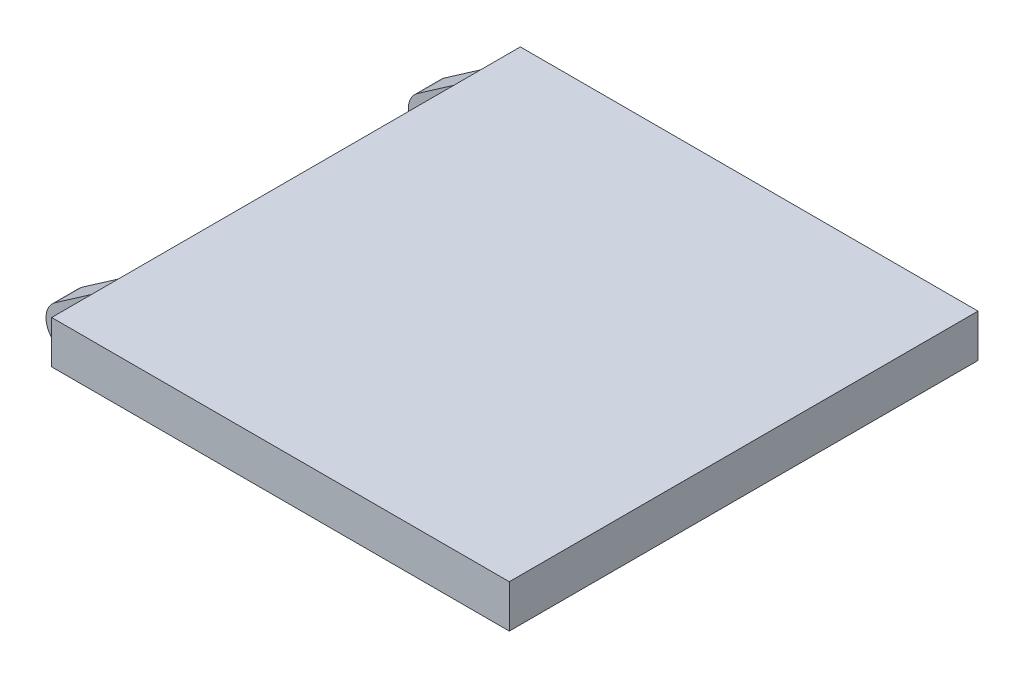
ISO-10303-21;
HEADER;
FILE_DESCRIPTION(('STEP AP214'),'2;1');
FILE_NAME('part.step','',(''),(''),'','','');
FILE_SCHEMA(('AUTOMOTIVE_DESIGN { 1 0 10303 214 1 1 1 1 }'));
ENDSEC;
DATA;
#1=APPLICATION_CONTEXT('core data for automotive mechanical design processes');
#2=APPLICATION_PROTOCOL_DEFINITION('international standard','automotive_design',2000,#1);
#3=PRODUCT_CONTEXT('',#1,'mechanical');
#4=PRODUCT('Part','Part','',(#3));
#5=PRODUCT_RELATED_PRODUCT_CATEGORY('part','',(#4));
#6=PRODUCT_DEFINITION_FORMATION('','',#4);
#7=PRODUCT_DEFINITION_CONTEXT('part definition',#1,'design');
#8=PRODUCT_DEFINITION('design','',#6,#7);
#9=PRODUCT_DEFINITION_SHAPE('','',#8);
#10=(LENGTH_UNIT() NAMED_UNIT(*) SI_UNIT(.MILLI.,.METRE.));
#11=(NAMED_UNIT(*) PLANE_ANGLE_UNIT() SI_UNIT($,.RADIAN.));
#12=(NAMED_UNIT(*) SI_UNIT($,.STERADIAN.) SOLID_ANGLE_UNIT());
#13=UNCERTAINTY_MEASURE_WITH_UNIT(LENGTH_MEASURE(1.E-05),#10,'distance_accuracy_value','');
#14=(GEOMETRIC_REPRESENTATION_CONTEXT(3) GLOBAL_UNCERTAINTY_ASSIGNED_CONTEXT((#13)) GLOBAL_UNIT_ASSIGNED_CONTEXT((#10,
#11,#12)) REPRESENTATION_CONTEXT('',''));
#15=CARTESIAN_POINT('',(0.,0.,0.));
#16=DIRECTION('',(0.,0.,1.));
#17=DIRECTION('',(1.,0.,0.));
#18=AXIS2_PLACEMENT_3D('',#15,#16,#17);
#19=CARTESIAN_POINT('',(-47.2791010767312,0.,-31.37));
#20=DIRECTION('',(0.,0.,-1.));
#21=DIRECTION('',(1.,0.,0.));
#22=AXIS2_PLACEMENT_3D('',#19,#20,#21);
#23=CYLINDRICAL_SURFACE('',#22,4.);
#24=CARTESIAN_POINT('',(-47.2791010767312,0.,-36.37));
#25=DIRECTION('',(0.,0.,-1.));
#26=DIRECTION('',(-1.,0.,0.));
#27=AXIS2_PLACEMENT_3D('',#24,#25,#26);
#28=CIRCLE('',#27,4.);
#29=CARTESIAN_POINT('',(-43.2791010767312,0.,-36.37));
#30=VERTEX_POINT('',#29);
#31=CARTESIAN_POINT('',(-49.5623460176183,3.28432527924895,-36.37));
#32=VERTEX_POINT('',#31);
#33=EDGE_CURVE('E126',#30,#32,#28,.T.);
#34=ORIENTED_EDGE('',*,*,#33,.F.);
#35=DIRECTION('',(0.,0.,-1.));
#36=VECTOR('',#35,1.);
#37=CARTESIAN_POINT('',(-43.2791010767312,0.,-31.37));
#38=LINE('',#37,#36);
#39=CARTESIAN_POINT('',(-43.2791010767312,0.,-31.37));
#40=VERTEX_POINT('',#39);
#41=EDGE_CURVE('E125',#40,#30,#38,.T.);
#42=ORIENTED_EDGE('',*,*,#41,.F.);
#43=CARTESIAN_POINT('',(-47.2791010767312,0.,-31.37));
#44=DIRECTION('',(0.,0.,-1.));
#45=DIRECTION('',(-1.,0.,0.));
#46=AXIS2_PLACEMENT_3D('',#43,#44,#45);
#47=CIRCLE('',#46,4.);
#48=CARTESIAN_POINT('',(-49.5623460176183,3.28432527924895,-31.37));
#49=VERTEX_POINT('',#48);
#50=EDGE_CURVE('E119',#40,#49,#47,.T.);
#51=ORIENTED_EDGE('',*,*,#50,.T.);
#52=DIRECTION('',(0.,0.,-1.));
#53=VECTOR('',#52,1.);
#54=CARTESIAN_POINT('',(-49.5623460176183,3.28432527924895,-31.37));
#55=LINE('',#54,#53);
#56=EDGE_CURVE('E12',#49,#32,#55,.T.);
#57=ORIENTED_EDGE('',*,*,#56,.T.);
#58=EDGE_LOOP('',(#34,#42,#51,#57));
#59=FACE_BOUND('',#58,.T.);
#60=ADVANCED_FACE('F60',(#59),#23,.T.);
#61=CARTESIAN_POINT('',(-42.7791010767312,8.,-31.37));
#62=DIRECTION('',(0.570811235221759,-0.82108131981224,0.));
#63=DIRECTION('',(0.82108131981224,0.570811235221759,0.));
#64=AXIS2_PLACEMENT_3D('',#61,#62,#63);
#65=PLANE('',#64);
#66=DIRECTION('',(0.82108131981224,0.570811235221759,0.));
#67=VECTOR('',#66,1.);
#68=CARTESIAN_POINT('',(-42.7791010767312,8.,-36.37));
#69=LINE('',#68,#67);
#70=CARTESIAN_POINT('',(-42.7791010767312,8.,-36.37));
#71=VERTEX_POINT('',#70);
#72=EDGE_CURVE('E128',#32,#71,#69,.T.);
#73=ORIENTED_EDGE('',*,*,#72,.F.);
#74=ORIENTED_EDGE('',*,*,#56,.F.);
#75=DIRECTION('',(0.82108131981224,0.570811235221759,0.));
#76=VECTOR('',#75,1.);
#77=CARTESIAN_POINT('',(-42.7791010767312,8.,-31.37));
#78=LINE('',#77,#76);
#79=CARTESIAN_POINT('',(-42.7791010767312,8.,-31.37));
#80=VERTEX_POINT('',#79);
#81=EDGE_CURVE('E102',#49,#80,#78,.T.);
#82=ORIENTED_EDGE('',*,*,#81,.T.);
#83=DIRECTION('',(0.,0.,-1.));
#84=VECTOR('',#83,1.);
#85=CARTESIAN_POINT('',(-42.7791010767312,8.,-31.37));
#86=LINE('',#85,#84);
#87=EDGE_CURVE('E69',#80,#71,#86,.T.);
#88=ORIENTED_EDGE('',*,*,#87,.T.);
#89=EDGE_LOOP('',(#73,#74,#82,#88));
#90=FACE_BOUND('',#89,.T.);
#91=ADVANCED_FACE('F117',(#90),#65,.F.);
#92=CARTESIAN_POINT('',(-42.7791010767312,0.,-31.37));
#93=DIRECTION('',(-1.,0.,0.));
#94=DIRECTION('',(0.,0.,-1.));
#95=AXIS2_PLACEMENT_3D('',#92,#93,#94);
#96=PLANE('',#95);
#97=DIRECTION('',(0.,-1.,0.));
#98=VECTOR('',#97,1.);
#99=CARTESIAN_POINT('',(-42.7791010767312,0.,-36.37));
#100=LINE('',#99,#98);
#101=CARTESIAN_POINT('',(-42.7791010767312,0.,-36.37));
#102=VERTEX_POINT('',#101);
#103=EDGE_CURVE('E112',#71,#102,#100,.T.);
#104=ORIENTED_EDGE('',*,*,#103,.F.);
#105=ORIENTED_EDGE('',*,*,#87,.F.);
#106=DIRECTION('',(0.,-1.,0.));
#107=VECTOR('',#106,1.);
#108=CARTESIAN_POINT('',(-42.7791010767312,0.,-31.37));
#109=LINE('',#108,#107);
#110=CARTESIAN_POINT('',(-42.7791010767312,0.,-31.37));
#111=VERTEX_POINT('',#110);
#112=EDGE_CURVE('E105',#80,#111,#109,.T.);
#113=ORIENTED_EDGE('',*,*,#112,.T.);
#114=DIRECTION('',(0.,0.,-1.));
#115=VECTOR('',#114,1.);
#116=CARTESIAN_POINT('',(-42.7791010767312,0.,-31.37));
#117=LINE('',#116,#115);
#118=EDGE_CURVE('E115',#111,#102,#117,.T.);
#119=ORIENTED_EDGE('',*,*,#118,.T.);
#120=EDGE_LOOP('',(#104,#105,#113,#119));
#121=FACE_BOUND('',#120,.T.);
#122=ADVANCED_FACE('F111',(#121),#96,.F.);
#123=CARTESIAN_POINT('',(-42.7791010767312,0.,-31.37));
#124=DIRECTION('',(0.,1.,0.));
#125=DIRECTION('',(0.,0.,-1.));
#126=AXIS2_PLACEMENT_3D('',#123,#124,#125);
#127=PLANE('',#126);
#128=DIRECTION('',(-1.,0.,0.));
#129=VECTOR('',#128,1.);
#130=CARTESIAN_POINT('',(-42.7791010767312,0.,-36.37));
#131=LINE('',#130,#129);
#132=EDGE_CURVE('E91',#102,#30,#131,.T.);
#133=ORIENTED_EDGE('',*,*,#132,.F.);
#134=ORIENTED_EDGE('',*,*,#118,.F.);
#135=DIRECTION('',(-1.,0.,0.));
#136=VECTOR('',#135,1.);
#137=CARTESIAN_POINT('',(-42.7791010767312,0.,-31.37));
#138=LINE('',#137,#136);
#139=EDGE_CURVE('E77',#111,#40,#138,.T.);
#140=ORIENTED_EDGE('',*,*,#139,.T.);
#141=ORIENTED_EDGE('',*,*,#41,.T.);
#142=EDGE_LOOP('',(#133,#134,#140,#141));
#143=FACE_BOUND('',#142,.T.);
#144=ADVANCED_FACE('F137',(#143),#127,.F.);
#145=CARTESIAN_POINT('',(-47.2791010767312,0.,-31.37));
#146=DIRECTION('',(0.,0.,1.));
#147=DIRECTION('',(-1.,0.,0.));
#148=AXIS2_PLACEMENT_3D('',#145,#146,#147);
#149=PLANE('',#148);
#150=ORIENTED_EDGE('',*,*,#50,.F.);
#151=ORIENTED_EDGE('',*,*,#139,.F.);
#152=ORIENTED_EDGE('',*,*,#112,.F.);
#153=ORIENTED_EDGE('',*,*,#81,.F.);
#154=EDGE_LOOP('',(#150,#151,#152,#153));
#155=FACE_BOUND('',#154,.T.);
#156=ADVANCED_FACE('F107',(#155),#149,.T.);
#157=CARTESIAN_POINT('',(-47.2791010767312,0.,-36.37));
#158=DIRECTION('',(0.,0.,1.));
#159=DIRECTION('',(-1.,0.,0.));
#160=AXIS2_PLACEMENT_3D('',#157,#158,#159);
#161=PLANE('',#160);
#162=CARTESIAN_POINT('',(-47.2791010767312,0.,-36.37));
#163=DIRECTION('',(0.,0.,-1.));
#164=DIRECTION('',(-1.,0.,0.));
#165=AXIS2_PLACEMENT_3D('',#162,#163,#164);
#166=CIRCLE('',#165,1.85040319829409);
#167=CARTESIAN_POINT('',(-49.1295042750253,0.,-36.37));
#168=VERTEX_POINT('',#167);
#169=EDGE_CURVE('E63',#168,#168,#166,.F.);
#170=ORIENTED_EDGE('',*,*,#169,.T.);
#171=EDGE_LOOP('',(#170));
#172=FACE_BOUND('',#171,.T.);
#173=ORIENTED_EDGE('',*,*,#33,.T.);
#174=ORIENTED_EDGE('',*,*,#72,.T.);
#175=ORIENTED_EDGE('',*,*,#103,.T.);
#176=ORIENTED_EDGE('',*,*,#132,.T.);
#177=EDGE_LOOP('',(#173,#174,#175,#176));
#178=FACE_BOUND('',#177,.T.);
#179=ADVANCED_FACE('F133',(#172,#178),#161,.F.);
#180=CARTESIAN_POINT('',(-47.2791010767312,0.,-36.97));
#181=DIRECTION('',(0.,0.,-1.));
#182=DIRECTION('',(-1.,0.,0.));
#183=AXIS2_PLACEMENT_3D('',#180,#181,#182);
#184=CONICAL_SURFACE('',#183,2.,0.244346095279207);
#185=CARTESIAN_POINT('',(-47.2791010767312,0.,-33.9280781044003));
#186=DIRECTION('',(0.,0.,1.));
#187=DIRECTION('',(1.,0.,0.));
#188=AXIS2_PLACEMENT_3D('',#185,#186,#187);
#189=CIRCLE('',#188,1.24156368896519);
#190=CARTESIAN_POINT('',(-46.037537387766,0.,-33.9280781044003));
#191=VERTEX_POINT('',#190);
#192=EDGE_CURVE('E218',#191,#191,#189,.T.);
#193=ORIENTED_EDGE('',*,*,#192,.T.);
#194=EDGE_LOOP('',(#193));
#195=FACE_BOUND('',#194,.T.);
#196=ORIENTED_EDGE('',*,*,#169,.F.);
#197=EDGE_LOOP('',(#196));
#198=FACE_BOUND('',#197,.T.);
#199=ADVANCED_FACE('F178',(#195,#198),#184,.F.);
#200=CARTESIAN_POINT('',(-47.2791010767312,0.,-33.17));
#201=DIRECTION('',(0.,0.,1.));
#202=DIRECTION('',(-1.,0.,0.));
#203=AXIS2_PLACEMENT_3D('',#200,#201,#202);
#204=PLANE('',#203);
#205=CARTESIAN_POINT('',(-47.2791010767312,0.,-33.17));
#206=DIRECTION('',(0.,0.,-1.));
#207=DIRECTION('',(-1.,0.,0.));
#208=AXIS2_PLACEMENT_3D('',#205,#206,#207);
#209=CIRCLE('',#208,0.271267962689198);
#210=CARTESIAN_POINT('',(-47.5503690394204,0.,-33.17));
#211=VERTEX_POINT('',#210);
#212=EDGE_CURVE('E221',#211,#211,#209,.T.);
#213=ORIENTED_EDGE('',*,*,#212,.T.);
#214=EDGE_LOOP('',(#213));
#215=FACE_BOUND('',#214,.T.);
#216=ADVANCED_FACE('F188',(#215),#204,.F.);
#217=CARTESIAN_POINT('',(-47.2791010767312,0.,-34.17));
#218=DIRECTION('',(0.,0.,1.));
#219=DIRECTION('',(-1.,0.,0.));
#220=AXIS2_PLACEMENT_3D('',#217,#218,#219);
#221=DEGENERATE_TOROIDAL_SURFACE('',#220,0.271267962689198,1.,.T.);
#222=ORIENTED_EDGE('',*,*,#192,.F.);
#223=EDGE_LOOP('',(#222));
#224=FACE_BOUND('',#223,.T.);
#225=ORIENTED_EDGE('',*,*,#212,.F.);
#226=EDGE_LOOP('',(#225));
#227=FACE_BOUND('',#226,.T.);
#228=ADVANCED_FACE('F201',(#224,#227),#221,.F.);
#229=CLOSED_SHELL('',(#60,#91,#122,#144,#156,#179,#199,#216,#228));
#230=MANIFOLD_SOLID_BREP('B2',#229);
#231=CARTESIAN_POINT('',(-47.2791010767312,0.,32.77));
#232=DIRECTION('',(0.,0.,-1.));
#233=DIRECTION('',(-1.,0.,0.));
#234=AXIS2_PLACEMENT_3D('',#231,#232,#233);
#235=PLANE('',#234);
#236=CARTESIAN_POINT('',(-47.2791010767312,0.,32.77));
#237=DIRECTION('',(0.,0.,-1.));
#238=DIRECTION('',(-1.,0.,0.));
#239=AXIS2_PLACEMENT_3D('',#236,#237,#238);
#240=CIRCLE('',#239,0.271267962689198);
#241=CARTESIAN_POINT('',(-47.5503690394204,0.,32.77));
#242=VERTEX_POINT('',#241);
#243=EDGE_CURVE('E59',#242,#242,#240,.T.);
#244=ORIENTED_EDGE('',*,*,#243,.F.);
#245=EDGE_LOOP('',(#244));
#246=FACE_BOUND('',#245,.T.);
#247=ADVANCED_FACE('F243',(#246),#235,.F.);
#248=CARTESIAN_POINT('',(-47.2791010767312,0.,34.17));
#249=DIRECTION('',(0.,0.,-1.));
#250=DIRECTION('',(-1.,0.,0.));
#251=AXIS2_PLACEMENT_3D('',#248,#249,#250);
#252=DEGENERATE_TOROIDAL_SURFACE('',#251,0.271267962689198,1.4,.T.);
#253=CARTESIAN_POINT('',(-47.2791010767312,0.,33.8313093461605));
#254=DIRECTION('',(0.,0.,-1.));
#255=DIRECTION('',(-1.,0.,0.));
#256=AXIS2_PLACEMENT_3D('',#253,#254,#255);
#257=CIRCLE('',#256,1.62968197947559);
#258=CARTESIAN_POINT('',(-48.9087830562068,0.,33.8313093461605));
#259=VERTEX_POINT('',#258);
#260=EDGE_CURVE('E254',#259,#259,#257,.F.);
#261=ORIENTED_EDGE('',*,*,#260,.T.);
#262=EDGE_LOOP('',(#261));
#263=FACE_BOUND('',#262,.T.);
#264=ORIENTED_EDGE('',*,*,#243,.T.);
#265=EDGE_LOOP('',(#264));
#266=FACE_BOUND('',#265,.T.);
#267=ADVANCED_FACE('F258',(#263,#266),#252,.F.);
#268=CARTESIAN_POINT('',(-47.2791010767312,0.,36.8732312417601));
#269=DIRECTION('',(0.,0.,1.));
#270=DIRECTION('',(-1.,0.,0.));
#271=AXIS2_PLACEMENT_3D('',#268,#269,#270);
#272=CONICAL_SURFACE('',#271,2.3881182905104,0.244346095279207);
#273=ORIENTED_EDGE('',*,*,#260,.F.);
#274=EDGE_LOOP('',(#273));
#275=FACE_BOUND('',#274,.T.);
#276=CARTESIAN_POINT('',(-47.2791010767312,0.,36.2732312417601));
#277=DIRECTION('',(0.,0.,1.));
#278=DIRECTION('',(1.,0.,0.));
#279=AXIS2_PLACEMENT_3D('',#276,#277,#278);
#280=CIRCLE('',#279,2.23852148880449);
#281=CARTESIAN_POINT('',(-45.0405795879267,0.,36.2732312417601));
#282=VERTEX_POINT('',#281);
#283=EDGE_CURVE('E246',#282,#282,#280,.T.);
#284=ORIENTED_EDGE('',*,*,#283,.T.);
#285=EDGE_LOOP('',(#284));
#286=FACE_BOUND('',#285,.T.);
#287=ADVANCED_FACE('F244',(#275,#286),#272,.F.);
#288=OPEN_SHELL('',(#247,#267,#287));
#289=SHELL_BASED_SURFACE_MODEL('B6',(#288));
#290=CARTESIAN_POINT('',(-47.2791010767312,0.,31.37));
#291=DIRECTION('',(0.,0.,1.));
#292=DIRECTION('',(1.,0.,0.));
#293=AXIS2_PLACEMENT_3D('',#290,#291,#292);
#294=CYLINDRICAL_SURFACE('',#293,4.);
#295=CARTESIAN_POINT('',(-47.2791010767312,0.,36.37));
#296=DIRECTION('',(0.,0.,-1.));
#297=DIRECTION('',(-1.,0.,0.));
#298=AXIS2_PLACEMENT_3D('',#295,#296,#297);
#299=CIRCLE('',#298,4.);
#300=CARTESIAN_POINT('',(-43.2791010767312,0.,36.37));
#301=VERTEX_POINT('',#300);
#302=CARTESIAN_POINT('',(-49.5623460176183,3.28432527924895,36.37));
#303=VERTEX_POINT('',#302);
#304=EDGE_CURVE('E367',#301,#303,#299,.T.);
#305=ORIENTED_EDGE('',*,*,#304,.T.);
#306=DIRECTION('',(0.,0.,1.));
#307=VECTOR('',#306,1.);
#308=CARTESIAN_POINT('',(-49.5623460176183,3.28432527924895,31.37));
#309=LINE('',#308,#307);
#310=CARTESIAN_POINT('',(-49.5623460176183,3.28432527924895,31.37));
#311=VERTEX_POINT('',#310);
#312=EDGE_CURVE('E241',#311,#303,#309,.T.);
#313=ORIENTED_EDGE('',*,*,#312,.F.);
#314=CARTESIAN_POINT('',(-47.2791010767312,0.,31.37));
#315=DIRECTION('',(0.,0.,-1.));
#316=DIRECTION('',(-1.,0.,0.));
#317=AXIS2_PLACEMENT_3D('',#314,#315,#316);
#318=CIRCLE('',#317,4.);
#319=CARTESIAN_POINT('',(-43.2791010767312,0.,31.37));
#320=VERTEX_POINT('',#319);
#321=EDGE_CURVE('E354',#320,#311,#318,.T.);
#322=ORIENTED_EDGE('',*,*,#321,.F.);
#323=DIRECTION('',(0.,0.,1.));
#324=VECTOR('',#323,1.);
#325=CARTESIAN_POINT('',(-43.2791010767312,0.,31.37));
#326=LINE('',#325,#324);
#327=EDGE_CURVE('E363',#320,#301,#326,.T.);
#328=ORIENTED_EDGE('',*,*,#327,.T.);
#329=EDGE_LOOP('',(#305,#313,#322,#328));
#330=FACE_BOUND('',#329,.T.);
#331=ADVANCED_FACE('F302',(#330),#294,.T.);
#332=CARTESIAN_POINT('',(-42.7791010767312,8.,31.37));
#333=DIRECTION('',(0.570811235221759,-0.82108131981224,0.));
#334=DIRECTION('',(0.82108131981224,0.570811235221759,0.));
#335=AXIS2_PLACEMENT_3D('',#332,#333,#334);
#336=PLANE('',#335);
#337=DIRECTION('',(0.82108131981224,0.570811235221759,0.));
#338=VECTOR('',#337,1.);
#339=CARTESIAN_POINT('',(-42.7791010767312,8.,36.37));
#340=LINE('',#339,#338);
#341=CARTESIAN_POINT('',(-42.7791010767312,8.,36.37));
#342=VERTEX_POINT('',#341);
#343=EDGE_CURVE('E358',#303,#342,#340,.T.);
#344=ORIENTED_EDGE('',*,*,#343,.T.);
#345=DIRECTION('',(0.,0.,1.));
#346=VECTOR('',#345,1.);
#347=CARTESIAN_POINT('',(-42.7791010767312,8.,31.37));
#348=LINE('',#347,#346);
#349=CARTESIAN_POINT('',(-42.7791010767312,8.,31.37));
#350=VERTEX_POINT('',#349);
#351=EDGE_CURVE('E311',#350,#342,#348,.T.);
#352=ORIENTED_EDGE('',*,*,#351,.F.);
#353=DIRECTION('',(0.82108131981224,0.570811235221759,0.));
#354=VECTOR('',#353,1.);
#355=CARTESIAN_POINT('',(-42.7791010767312,8.,31.37));
#356=LINE('',#355,#354);
#357=EDGE_CURVE('E349',#311,#350,#356,.T.);
#358=ORIENTED_EDGE('',*,*,#357,.F.);
#359=ORIENTED_EDGE('',*,*,#312,.T.);
#360=EDGE_LOOP('',(#344,#352,#358,#359));
#361=FACE_BOUND('',#360,.T.);
#362=ADVANCED_FACE('F357',(#361),#336,.F.);
#363=CARTESIAN_POINT('',(-42.7791010767312,0.,31.37));
#364=DIRECTION('',(-1.,0.,0.));
#365=DIRECTION('',(0.,0.,1.));
#366=AXIS2_PLACEMENT_3D('',#363,#364,#365);
#367=PLANE('',#366);
#368=DIRECTION('',(0.,-1.,0.));
#369=VECTOR('',#368,1.);
#370=CARTESIAN_POINT('',(-42.7791010767312,0.,36.37));
#371=LINE('',#370,#369);
#372=CARTESIAN_POINT('',(-42.7791010767312,0.,36.37));
#373=VERTEX_POINT('',#372);
#374=EDGE_CURVE('E336',#342,#373,#371,.T.);
#375=ORIENTED_EDGE('',*,*,#374,.T.);
#376=DIRECTION('',(0.,0.,1.));
#377=VECTOR('',#376,1.);
#378=CARTESIAN_POINT('',(-42.7791010767312,0.,31.37));
#379=LINE('',#378,#377);
#380=CARTESIAN_POINT('',(-42.7791010767312,0.,31.37));
#381=VERTEX_POINT('',#380);
#382=EDGE_CURVE('E359',#381,#373,#379,.T.);
#383=ORIENTED_EDGE('',*,*,#382,.F.);
#384=DIRECTION('',(0.,-1.,0.));
#385=VECTOR('',#384,1.);
#386=CARTESIAN_POINT('',(-42.7791010767312,0.,31.37));
#387=LINE('',#386,#385);
#388=EDGE_CURVE('E352',#350,#381,#387,.T.);
#389=ORIENTED_EDGE('',*,*,#388,.F.);
#390=ORIENTED_EDGE('',*,*,#351,.T.);
#391=EDGE_LOOP('',(#375,#383,#389,#390));
#392=FACE_BOUND('',#391,.T.);
#393=ADVANCED_FACE('F361',(#392),#367,.F.);
#394=CARTESIAN_POINT('',(-42.7791010767312,0.,31.37));
#395=DIRECTION('',(0.,1.,0.));
#396=DIRECTION('',(0.,0.,1.));
#397=AXIS2_PLACEMENT_3D('',#394,#395,#396);
#398=PLANE('',#397);
#399=DIRECTION('',(-1.,0.,0.));
#400=VECTOR('',#399,1.);
#401=CARTESIAN_POINT('',(-42.7791010767312,0.,36.37));
#402=LINE('',#401,#400);
#403=EDGE_CURVE('E342',#373,#301,#402,.T.);
#404=ORIENTED_EDGE('',*,*,#403,.T.);
#405=ORIENTED_EDGE('',*,*,#327,.F.);
#406=DIRECTION('',(-1.,0.,0.));
#407=VECTOR('',#406,1.);
#408=CARTESIAN_POINT('',(-42.7791010767312,0.,31.37));
#409=LINE('',#408,#407);
#410=EDGE_CURVE('E319',#381,#320,#409,.T.);
#411=ORIENTED_EDGE('',*,*,#410,.F.);
#412=ORIENTED_EDGE('',*,*,#382,.T.);
#413=EDGE_LOOP('',(#404,#405,#411,#412));
#414=FACE_BOUND('',#413,.T.);
#415=ADVANCED_FACE('F374',(#414),#398,.F.);
#416=CARTESIAN_POINT('',(-47.2791010767312,0.,31.37));
#417=DIRECTION('',(0.,0.,-1.));
#418=DIRECTION('',(-1.,0.,0.));
#419=AXIS2_PLACEMENT_3D('',#416,#417,#418);
#420=PLANE('',#419);
#421=ORIENTED_EDGE('',*,*,#321,.T.);
#422=ORIENTED_EDGE('',*,*,#357,.T.);
#423=ORIENTED_EDGE('',*,*,#388,.T.);
#424=ORIENTED_EDGE('',*,*,#410,.T.);
#425=EDGE_LOOP('',(#421,#422,#423,#424));
#426=FACE_BOUND('',#425,.T.);
#427=ADVANCED_FACE('F350',(#426),#420,.T.);
#428=CARTESIAN_POINT('',(-47.2791010767312,0.,36.37));
#429=DIRECTION('',(0.,0.,-1.));
#430=DIRECTION('',(-1.,0.,0.));
#431=AXIS2_PLACEMENT_3D('',#428,#429,#430);
#432=PLANE('',#431);
#433=CARTESIAN_POINT('',(-47.2791010767312,0.,36.37));
#434=DIRECTION('',(0.,0.,-1.));
#435=DIRECTION('',(-1.,0.,0.));
#436=AXIS2_PLACEMENT_3D('',#433,#434,#435);
#437=CIRCLE('',#436,1.85040319829409);
#438=CARTESIAN_POINT('',(-49.1295042750253,0.,36.37));
#439=VERTEX_POINT('',#438);
#440=EDGE_CURVE('E305',#439,#439,#437,.F.);
#441=ORIENTED_EDGE('',*,*,#440,.F.);
#442=EDGE_LOOP('',(#441));
#443=FACE_BOUND('',#442,.T.);
#444=ORIENTED_EDGE('',*,*,#304,.F.);
#445=ORIENTED_EDGE('',*,*,#403,.F.);
#446=ORIENTED_EDGE('',*,*,#374,.F.);
#447=ORIENTED_EDGE('',*,*,#343,.F.);
#448=EDGE_LOOP('',(#444,#445,#446,#447));
#449=FACE_BOUND('',#448,.T.);
#450=ADVANCED_FACE('F377',(#443,#449),#432,.F.);
#451=CARTESIAN_POINT('',(-47.2791010767312,0.,36.97));
#452=DIRECTION('',(0.,0.,1.));
#453=DIRECTION('',(-1.,0.,0.));
#454=AXIS2_PLACEMENT_3D('',#451,#452,#453);
#455=CONICAL_SURFACE('',#454,2.,0.244346095279207);
#456=CARTESIAN_POINT('',(-47.2791010767312,0.,33.9280781044003));
#457=DIRECTION('',(0.,0.,1.));
#458=DIRECTION('',(1.,0.,0.));
#459=AXIS2_PLACEMENT_3D('',#456,#457,#458);
#460=CIRCLE('',#459,1.24156368896519);
#461=CARTESIAN_POINT('',(-46.037537387766,0.,33.9280781044003));
#462=VERTEX_POINT('',#461);
#463=EDGE_CURVE('E380',#462,#462,#460,.T.);
#464=ORIENTED_EDGE('',*,*,#463,.F.);
#465=EDGE_LOOP('',(#464));
#466=FACE_BOUND('',#465,.T.);
#467=ORIENTED_EDGE('',*,*,#440,.T.);
#468=EDGE_LOOP('',(#467));
#469=FACE_BOUND('',#468,.T.);
#470=ADVANCED_FACE('F391',(#466,#469),#455,.F.);
#471=CARTESIAN_POINT('',(-47.2791010767312,0.,33.17));
#472=DIRECTION('',(0.,0.,-1.));
#473=DIRECTION('',(-1.,0.,0.));
#474=AXIS2_PLACEMENT_3D('',#471,#472,#473);
#475=PLANE('',#474);
#476=CARTESIAN_POINT('',(-47.2791010767312,0.,33.17));
#477=DIRECTION('',(0.,0.,-1.));
#478=DIRECTION('',(-1.,0.,0.));
#479=AXIS2_PLACEMENT_3D('',#476,#477,#478);
#480=CIRCLE('',#479,0.271267962689198);
#481=CARTESIAN_POINT('',(-47.5503690394204,0.,33.17));
#482=VERTEX_POINT('',#481);
#483=EDGE_CURVE('E383',#482,#482,#480,.T.);
#484=ORIENTED_EDGE('',*,*,#483,.F.);
#485=EDGE_LOOP('',(#484));
#486=FACE_BOUND('',#485,.T.);
#487=ADVANCED_FACE('F389',(#486),#475,.F.);
#488=CARTESIAN_POINT('',(-47.2791010767312,0.,34.17));
#489=DIRECTION('',(0.,0.,-1.));
#490=DIRECTION('',(-1.,0.,0.));
#491=AXIS2_PLACEMENT_3D('',#488,#489,#490);
#492=DEGENERATE_TOROIDAL_SURFACE('',#491,0.271267962689198,1.,.T.);
#493=ORIENTED_EDGE('',*,*,#463,.T.);
#494=EDGE_LOOP('',(#493));
#495=FACE_BOUND('',#494,.T.);
#496=ORIENTED_EDGE('',*,*,#483,.T.);
#497=EDGE_LOOP('',(#496));
#498=FACE_BOUND('',#497,.T.);
#499=ADVANCED_FACE('F387',(#495,#498),#492,.F.);
#500=CLOSED_SHELL('',(#331,#362,#393,#415,#427,#450,#470,#487,#499));
#501=MANIFOLD_SOLID_BREP('B54',#500);
#502=CARTESIAN_POINT('',(-42.7791010767312,8.,43.8119968773767));
#503=DIRECTION('',(1.,0.,0.));
#504=DIRECTION('',(0.,0.,-1.));
#505=AXIS2_PLACEMENT_3D('',#502,#503,#504);
#506=PLANE('',#505);
#507=DIRECTION('',(0.,0.,1.));
#508=VECTOR('',#507,1.);
#509=CARTESIAN_POINT('',(-42.7791010767312,0.,43.8119968773767));
#510=LINE('',#509,#508);
#511=CARTESIAN_POINT('',(-42.7791010767312,0.,-43.8119968773767));
#512=VERTEX_POINT('',#511);
#513=CARTESIAN_POINT('',(-42.7791010767312,0.,43.8119968773767));
#514=VERTEX_POINT('',#513);
#515=EDGE_CURVE('E537',#512,#514,#510,.T.);
#516=ORIENTED_EDGE('',*,*,#515,.T.);
#517=DIRECTION('',(0.,-1.,0.));
#518=VECTOR('',#517,1.);
#519=CARTESIAN_POINT('',(-42.7791010767312,8.,43.8119968773767));
#520=LINE('',#519,#518);
#521=CARTESIAN_POINT('',(-42.7791010767312,8.,43.8119968773767));
#522=VERTEX_POINT('',#521);
#523=EDGE_CURVE('E300',#522,#514,#520,.T.);
#524=ORIENTED_EDGE('',*,*,#523,.F.);
#525=DIRECTION('',(0.,0.,1.));
#526=VECTOR('',#525,1.);
#527=CARTESIAN_POINT('',(-42.7791010767312,8.,43.8119968773767));
#528=LINE('',#527,#526);
#529=CARTESIAN_POINT('',(-42.7791010767312,8.,-43.8119968773767));
#530=VERTEX_POINT('',#529);
#531=EDGE_CURVE('E525',#530,#522,#528,.T.);
#532=ORIENTED_EDGE('',*,*,#531,.F.);
#533=DIRECTION('',(0.,-1.,0.));
#534=VECTOR('',#533,1.);
#535=CARTESIAN_POINT('',(-42.7791010767312,8.,-43.8119968773767));
#536=LINE('',#535,#534);
#537=EDGE_CURVE('E533',#530,#512,#536,.T.);
#538=ORIENTED_EDGE('',*,*,#537,.T.);
#539=EDGE_LOOP('',(#516,#524,#532,#538));
#540=FACE_BOUND('',#539,.T.);
#541=ADVANCED_FACE('F474',(#540),#506,.F.);
#542=CARTESIAN_POINT('',(42.7791010767312,8.,43.8119968773767));
#543=DIRECTION('',(0.,0.,-1.));
#544=DIRECTION('',(-1.,0.,0.));
#545=AXIS2_PLACEMENT_3D('',#542,#543,#544);
#546=PLANE('',#545);
#547=DIRECTION('',(1.,0.,0.));
#548=VECTOR('',#547,1.);
#549=CARTESIAN_POINT('',(42.7791010767312,0.,43.8119968773767));
#550=LINE('',#549,#548);
#551=CARTESIAN_POINT('',(42.7791010767312,0.,43.8119968773767));
#552=VERTEX_POINT('',#551);
#553=EDGE_CURVE('E529',#514,#552,#550,.T.);
#554=ORIENTED_EDGE('',*,*,#553,.T.);
#555=DIRECTION('',(0.,-1.,0.));
#556=VECTOR('',#555,1.);
#557=CARTESIAN_POINT('',(42.7791010767312,8.,43.8119968773767));
#558=LINE('',#557,#556);
#559=CARTESIAN_POINT('',(42.7791010767312,8.,43.8119968773767));
#560=VERTEX_POINT('',#559);
#561=EDGE_CURVE('E482',#560,#552,#558,.T.);
#562=ORIENTED_EDGE('',*,*,#561,.F.);
#563=DIRECTION('',(1.,0.,0.));
#564=VECTOR('',#563,1.);
#565=CARTESIAN_POINT('',(42.7791010767312,8.,43.8119968773767));
#566=LINE('',#565,#564);
#567=EDGE_CURVE('E520',#522,#560,#566,.T.);
#568=ORIENTED_EDGE('',*,*,#567,.F.);
#569=ORIENTED_EDGE('',*,*,#523,.T.);
#570=EDGE_LOOP('',(#554,#562,#568,#569));
#571=FACE_BOUND('',#570,.T.);
#572=ADVANCED_FACE('F528',(#571),#546,.F.);
#573=CARTESIAN_POINT('',(42.7791010767312,8.,43.8119968773767));
#574=DIRECTION('',(-1.,0.,0.));
#575=DIRECTION('',(0.,0.,1.));
#576=AXIS2_PLACEMENT_3D('',#573,#574,#575);
#577=PLANE('',#576);
#578=DIRECTION('',(0.,0.,-1.));
#579=VECTOR('',#578,1.);
#580=CARTESIAN_POINT('',(42.7791010767312,0.,43.8119968773767));
#581=LINE('',#580,#579);
#582=CARTESIAN_POINT('',(42.7791010767312,0.,-43.8119968773767));
#583=VERTEX_POINT('',#582);
#584=EDGE_CURVE('E507',#552,#583,#581,.T.);
#585=ORIENTED_EDGE('',*,*,#584,.T.);
#586=DIRECTION('',(0.,-1.,0.));
#587=VECTOR('',#586,1.);
#588=CARTESIAN_POINT('',(42.7791010767312,8.,-43.8119968773767));
#589=LINE('',#588,#587);
#590=CARTESIAN_POINT('',(42.7791010767312,8.,-43.8119968773767));
#591=VERTEX_POINT('',#590);
#592=EDGE_CURVE('E530',#591,#583,#589,.T.);
#593=ORIENTED_EDGE('',*,*,#592,.F.);
#594=DIRECTION('',(0.,0.,-1.));
#595=VECTOR('',#594,1.);
#596=CARTESIAN_POINT('',(42.7791010767312,8.,43.8119968773767));
#597=LINE('',#596,#595);
#598=EDGE_CURVE('E523',#560,#591,#597,.T.);
#599=ORIENTED_EDGE('',*,*,#598,.F.);
#600=ORIENTED_EDGE('',*,*,#561,.T.);
#601=EDGE_LOOP('',(#585,#593,#599,#600));
#602=FACE_BOUND('',#601,.T.);
#603=ADVANCED_FACE('F531',(#602),#577,.F.);
#604=CARTESIAN_POINT('',(42.7791010767312,8.,-43.8119968773767));
#605=DIRECTION('',(0.,0.,1.));
#606=DIRECTION('',(1.,0.,0.));
#607=AXIS2_PLACEMENT_3D('',#604,#605,#606);
#608=PLANE('',#607);
#609=DIRECTION('',(-1.,0.,0.));
#610=VECTOR('',#609,1.);
#611=CARTESIAN_POINT('',(42.7791010767312,0.,-43.8119968773767));
#612=LINE('',#611,#610);
#613=EDGE_CURVE('E513',#583,#512,#612,.T.);
#614=ORIENTED_EDGE('',*,*,#613,.T.);
#615=ORIENTED_EDGE('',*,*,#537,.F.);
#616=DIRECTION('',(-1.,0.,0.));
#617=VECTOR('',#616,1.);
#618=CARTESIAN_POINT('',(42.7791010767312,8.,-43.8119968773767));
#619=LINE('',#618,#617);
#620=EDGE_CURVE('E490',#591,#530,#619,.T.);
#621=ORIENTED_EDGE('',*,*,#620,.F.);
#622=ORIENTED_EDGE('',*,*,#592,.T.);
#623=EDGE_LOOP('',(#614,#615,#621,#622));
#624=FACE_BOUND('',#623,.T.);
#625=ADVANCED_FACE('F544',(#624),#608,.F.);
#626=CARTESIAN_POINT('',(0.,8.,0.));
#627=DIRECTION('',(0.,1.,0.));
#628=DIRECTION('',(0.,0.,1.));
#629=AXIS2_PLACEMENT_3D('',#626,#627,#628);
#630=PLANE('',#629);
#631=ORIENTED_EDGE('',*,*,#531,.T.);
#632=ORIENTED_EDGE('',*,*,#567,.T.);
#633=ORIENTED_EDGE('',*,*,#598,.T.);
#634=ORIENTED_EDGE('',*,*,#620,.T.);
#635=EDGE_LOOP('',(#631,#632,#633,#634));
#636=FACE_BOUND('',#635,.T.);
#637=ADVANCED_FACE('F521',(#636),#630,.T.);
#638=CARTESIAN_POINT('',(0.,0.,0.));
#639=DIRECTION('',(0.,1.,0.));
#640=DIRECTION('',(0.,0.,1.));
#641=AXIS2_PLACEMENT_3D('',#638,#639,#640);
#642=PLANE('',#641);
#643=ORIENTED_EDGE('',*,*,#515,.F.);
#644=ORIENTED_EDGE('',*,*,#613,.F.);
#645=ORIENTED_EDGE('',*,*,#584,.F.);
#646=ORIENTED_EDGE('',*,*,#553,.F.);
#647=EDGE_LOOP('',(#643,#644,#645,#646));
#648=FACE_BOUND('',#647,.T.);
#649=ADVANCED_FACE('F547',(#648),#642,.F.);
#650=CLOSED_SHELL('',(#541,#572,#603,#625,#637,#649));
#651=MANIFOLD_SOLID_BREP('B235',#650);
#652=ADVANCED_BREP_SHAPE_REPRESENTATION('',(#18,#230,#501,#651),#14);
#653=MANIFOLD_SURFACE_SHAPE_REPRESENTATION('',(#18,#289),#14);
#654=SHAPE_REPRESENTATION('',(#18),#14);
#655=SHAPE_DEFINITION_REPRESENTATION(#9,#654);
#656=SHAPE_REPRESENTATION_RELATIONSHIP('','',#654,#652);
#657=SHAPE_REPRESENTATION_RELATIONSHIP('','',#654,#653);
ENDSEC;
END-ISO-10303-21;
